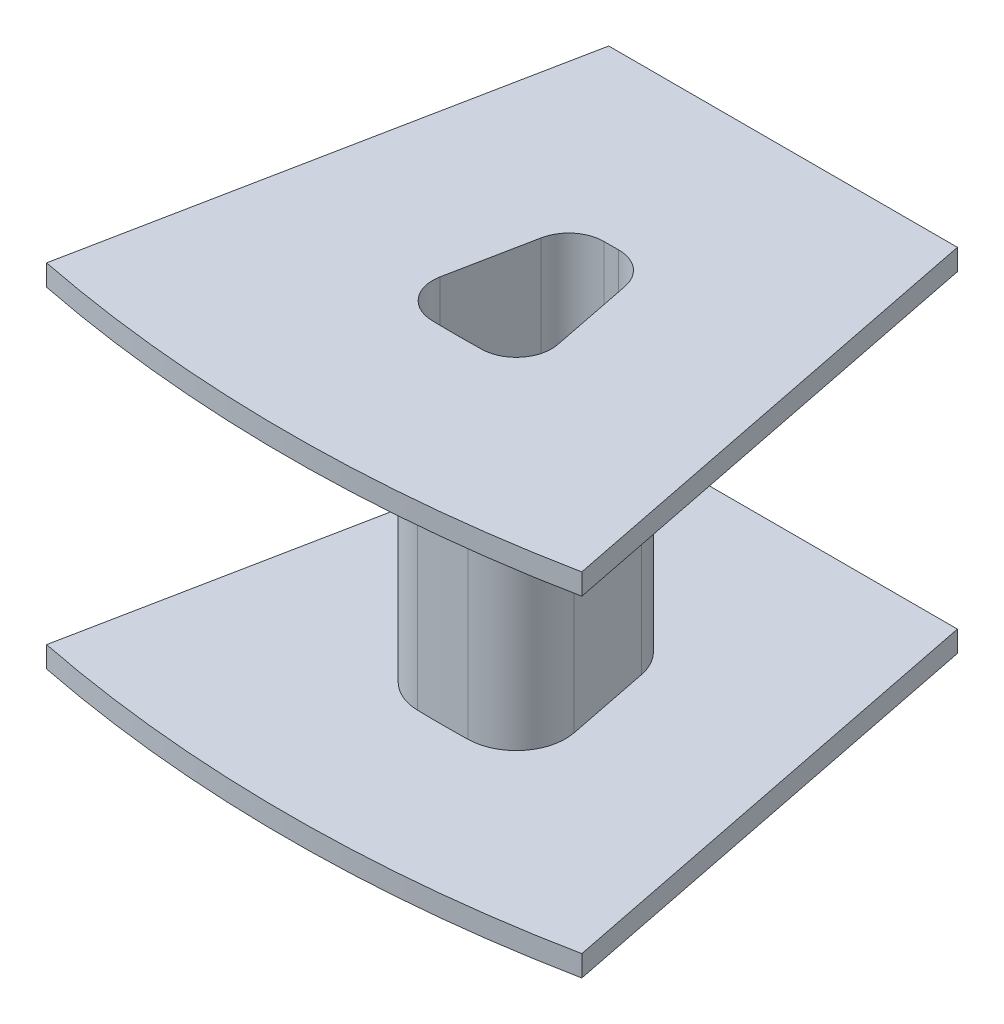
ISO-10303-21;
HEADER;
FILE_DESCRIPTION(('STEP AP214'),'2;1');
FILE_NAME('part.step','',(''),(''),'','','');
FILE_SCHEMA(('AUTOMOTIVE_DESIGN { 1 0 10303 214 1 1 1 1 }'));
ENDSEC;
DATA;
#1=APPLICATION_CONTEXT('core data for automotive mechanical design processes');
#2=APPLICATION_PROTOCOL_DEFINITION('international standard','automotive_design',2000,#1);
#3=PRODUCT_CONTEXT('',#1,'mechanical');
#4=PRODUCT('Part','Part','',(#3));
#5=PRODUCT_RELATED_PRODUCT_CATEGORY('part','',(#4));
#6=PRODUCT_DEFINITION_FORMATION('','',#4);
#7=PRODUCT_DEFINITION_CONTEXT('part definition',#1,'design');
#8=PRODUCT_DEFINITION('design','',#6,#7);
#9=PRODUCT_DEFINITION_SHAPE('','',#8);
#10=(LENGTH_UNIT() NAMED_UNIT(*) SI_UNIT(.MILLI.,.METRE.));
#11=(NAMED_UNIT(*) PLANE_ANGLE_UNIT() SI_UNIT($,.RADIAN.));
#12=(NAMED_UNIT(*) SI_UNIT($,.STERADIAN.) SOLID_ANGLE_UNIT());
#13=UNCERTAINTY_MEASURE_WITH_UNIT(LENGTH_MEASURE(1.E-05),#10,'distance_accuracy_value','');
#14=(GEOMETRIC_REPRESENTATION_CONTEXT(3) GLOBAL_UNCERTAINTY_ASSIGNED_CONTEXT((#13)) GLOBAL_UNIT_ASSIGNED_CONTEXT((#10,
#11,#12)) REPRESENTATION_CONTEXT('',''));
#15=CARTESIAN_POINT('',(0.,0.,0.));
#16=DIRECTION('',(0.,0.,1.));
#17=DIRECTION('',(1.,0.,0.));
#18=AXIS2_PLACEMENT_3D('',#15,#16,#17);
#19=CARTESIAN_POINT('',(0.,-8.5,0.));
#20=DIRECTION('',(0.,1.,0.));
#21=DIRECTION('',(0.,0.,1.));
#22=AXIS2_PLACEMENT_3D('',#19,#20,#21);
#23=PLANE('',#22);
#24=DIRECTION('',(0.195090322016122,0.,-0.980785280403232));
#25=VECTOR('',#24,1.);
#26=CARTESIAN_POINT('',(-19.0213063965724,-8.5,95.626564839315));
#27=LINE('',#26,#25);
#28=CARTESIAN_POINT('',(-19.0213063965724,-8.5,95.626564839315));
#29=VERTEX_POINT('',#28);
#30=CARTESIAN_POINT('',(-12.3920574933878,-8.5,62.2990800252019));
#31=VERTEX_POINT('',#30);
#32=EDGE_CURVE('E377',#29,#31,#27,.T.);
#33=ORIENTED_EDGE('',*,*,#32,.T.);
#34=DIRECTION('',(1.,0.,0.));
#35=VECTOR('',#34,1.);
#36=CARTESIAN_POINT('',(0.,-8.5,62.2990800252019));
#37=LINE('',#36,#35);
#38=CARTESIAN_POINT('',(12.3920574933878,-8.5,62.2990800252019));
#39=VERTEX_POINT('',#38);
#40=EDGE_CURVE('E276',#31,#39,#37,.T.);
#41=ORIENTED_EDGE('',*,*,#40,.T.);
#42=DIRECTION('',(0.195090322016122,0.,0.980785280403232));
#43=VECTOR('',#42,1.);
#44=CARTESIAN_POINT('',(19.0213063965724,-8.5,95.626564839315));
#45=LINE('',#44,#43);
#46=CARTESIAN_POINT('',(19.0213063965724,-8.5,95.626564839315));
#47=VERTEX_POINT('',#46);
#48=EDGE_CURVE('E381',#39,#47,#45,.T.);
#49=ORIENTED_EDGE('',*,*,#48,.T.);
#50=CARTESIAN_POINT('',(0.,-8.5,0.));
#51=DIRECTION('',(0.,-1.,0.));
#52=DIRECTION('',(0.,0.,1.));
#53=AXIS2_PLACEMENT_3D('',#50,#51,#52);
#54=CIRCLE('',#53,97.5);
#55=EDGE_CURVE('E374',#47,#29,#54,.T.);
#56=ORIENTED_EDGE('',*,*,#55,.T.);
#57=EDGE_LOOP('',(#33,#41,#49,#56));
#58=FACE_BOUND('',#57,.T.);
#59=CARTESIAN_POINT('',(0.,-8.5,0.));
#60=DIRECTION('',(0.,-1.,0.));
#61=DIRECTION('',(0.,0.,-1.));
#62=AXIS2_PLACEMENT_3D('',#59,#60,#61);
#63=CIRCLE('',#62,86.5);
#64=CARTESIAN_POINT('',(1.7947194017297,-8.5,86.4813793961975));
#65=VERTEX_POINT('',#64);
#66=CARTESIAN_POINT('',(-1.79471940172972,-8.5,86.4813793961975));
#67=VERTEX_POINT('',#66);
#68=EDGE_CURVE('E301',#65,#67,#63,.T.);
#69=ORIENTED_EDGE('',*,*,#68,.F.);
#70=CARTESIAN_POINT('',(1.72210069761349,-8.5,82.9821328310335));
#71=DIRECTION('',(0.,-1.,0.));
#72=DIRECTION('',(0.,0.,-1.));
#73=AXIS2_PLACEMENT_3D('',#70,#71,#72);
#74=CIRCLE('',#73,3.5);
#75=CARTESIAN_POINT('',(5.1548491790248,-8.5,82.299316703977));
#76=VERTEX_POINT('',#75);
#77=EDGE_CURVE('E306',#76,#65,#74,.T.);
#78=ORIENTED_EDGE('',*,*,#77,.F.);
#79=DIRECTION('',(0.195090322016121,0.,0.980785280403232));
#80=VECTOR('',#79,1.);
#81=CARTESIAN_POINT('',(3.96456366045838,-8.5,76.3153473095823));
#82=LINE('',#81,#80);
#83=CARTESIAN_POINT('',(3.96456366045838,-8.5,76.3153473095823));
#84=VERTEX_POINT('',#83);
#85=EDGE_CURVE('E345',#84,#76,#82,.T.);
#86=ORIENTED_EDGE('',*,*,#85,.F.);
#87=CARTESIAN_POINT('',(0.531815179047067,-8.5,76.9981634366388));
#88=DIRECTION('',(0.,-1.,0.));
#89=DIRECTION('',(0.,0.,-1.));
#90=AXIS2_PLACEMENT_3D('',#87,#88,#89);
#91=CIRCLE('',#90,3.50000000000001);
#92=CARTESIAN_POINT('',(0.507641761817665,-8.5,73.4982469167915));
#93=VERTEX_POINT('',#92);
#94=EDGE_CURVE('E342',#93,#84,#91,.T.);
#95=ORIENTED_EDGE('',*,*,#94,.F.);
#96=CARTESIAN_POINT('',(0.,-8.5,0.));
#97=DIRECTION('',(0.,1.,0.));
#98=DIRECTION('',(0.,0.,-1.));
#99=AXIS2_PLACEMENT_3D('',#96,#97,#98);
#100=CIRCLE('',#99,73.5);
#101=CARTESIAN_POINT('',(-0.507641761817631,-8.5,73.4982469167915));
#102=VERTEX_POINT('',#101);
#103=EDGE_CURVE('E339',#102,#93,#100,.T.);
#104=ORIENTED_EDGE('',*,*,#103,.F.);
#105=CARTESIAN_POINT('',(-0.531815179047067,-8.5,76.9981634366388));
#106=DIRECTION('',(0.,-1.,0.));
#107=DIRECTION('',(0.,0.,-1.));
#108=AXIS2_PLACEMENT_3D('',#105,#106,#107);
#109=CIRCLE('',#108,3.50000000000001);
#110=CARTESIAN_POINT('',(-3.96456366045838,-8.5,76.3153473095823));
#111=VERTEX_POINT('',#110);
#112=EDGE_CURVE('E336',#111,#102,#109,.T.);
#113=ORIENTED_EDGE('',*,*,#112,.F.);
#114=DIRECTION('',(0.195090322016122,0.,-0.980785280403232));
#115=VECTOR('',#114,1.);
#116=CARTESIAN_POINT('',(-5.1548491790248,-8.5,82.299316703977));
#117=LINE('',#116,#115);
#118=CARTESIAN_POINT('',(-5.1548491790248,-8.5,82.299316703977));
#119=VERTEX_POINT('',#118);
#120=EDGE_CURVE('E333',#119,#111,#117,.T.);
#121=ORIENTED_EDGE('',*,*,#120,.F.);
#122=CARTESIAN_POINT('',(-1.72210069761349,-8.5,82.9821328310335));
#123=DIRECTION('',(0.,-1.,0.));
#124=DIRECTION('',(0.,0.,-1.));
#125=AXIS2_PLACEMENT_3D('',#122,#123,#124);
#126=CIRCLE('',#125,3.5);
#127=EDGE_CURVE('E330',#67,#119,#126,.T.);
#128=ORIENTED_EDGE('',*,*,#127,.F.);
#129=EDGE_LOOP('',(#69,#78,#86,#95,#104,#113,#121,#128));
#130=FACE_BOUND('',#129,.T.);
#131=ADVANCED_FACE('F32',(#58,#130),#23,.F.);
#132=CARTESIAN_POINT('',(0.,-7.,0.));
#133=DIRECTION('',(0.,1.,0.));
#134=DIRECTION('',(0.,0.,1.));
#135=AXIS2_PLACEMENT_3D('',#132,#133,#134);
#136=PLANE('',#135);
#137=CARTESIAN_POINT('',(-0.531815179047067,-7.,76.9981634366388));
#138=DIRECTION('',(0.,1.,0.));
#139=DIRECTION('',(0.,0.,1.));
#140=AXIS2_PLACEMENT_3D('',#137,#138,#139);
#141=CIRCLE('',#140,2.50000000000001);
#142=CARTESIAN_POINT('',(-0.514548452454617,-7.,74.4982230653193));
#143=VERTEX_POINT('',#142);
#144=CARTESIAN_POINT('',(-2.98377838005515,-7.,76.5104376315985));
#145=VERTEX_POINT('',#144);
#146=EDGE_CURVE('E199',#143,#145,#141,.T.);
#147=ORIENTED_EDGE('',*,*,#146,.F.);
#148=CARTESIAN_POINT('',(0.,-7.,0.));
#149=DIRECTION('',(0.,1.,0.));
#150=DIRECTION('',(0.,0.,1.));
#151=AXIS2_PLACEMENT_3D('',#148,#149,#150);
#152=CIRCLE('',#151,74.5);
#153=CARTESIAN_POINT('',(0.51454845245463,-7.,74.4982230653193));
#154=VERTEX_POINT('',#153);
#155=EDGE_CURVE('E258',#154,#143,#152,.F.);
#156=ORIENTED_EDGE('',*,*,#155,.F.);
#157=CARTESIAN_POINT('',(0.531815179047067,-7.,76.9981634366388));
#158=DIRECTION('',(0.,1.,0.));
#159=DIRECTION('',(0.,0.,1.));
#160=AXIS2_PLACEMENT_3D('',#157,#158,#159);
#161=CIRCLE('',#160,2.5);
#162=CARTESIAN_POINT('',(2.98377838005514,-7.,76.5104376315985));
#163=VERTEX_POINT('',#162);
#164=EDGE_CURVE('E256',#163,#154,#161,.T.);
#165=ORIENTED_EDGE('',*,*,#164,.F.);
#166=DIRECTION('',(-0.195090322016122,0.,-0.980785280403232));
#167=VECTOR('',#166,1.);
#168=CARTESIAN_POINT('',(-11.7694233648383,-7.,2.34108386419336));
#169=LINE('',#168,#167);
#170=CARTESIAN_POINT('',(4.17406389862157,-7.,82.4944070259932));
#171=VERTEX_POINT('',#170);
#172=EDGE_CURVE('E254',#171,#163,#169,.T.);
#173=ORIENTED_EDGE('',*,*,#172,.F.);
#174=CARTESIAN_POINT('',(1.72210069761349,-7.,82.9821328310335));
#175=DIRECTION('',(0.,1.,0.));
#176=DIRECTION('',(0.,0.,1.));
#177=AXIS2_PLACEMENT_3D('',#174,#175,#176);
#178=CIRCLE('',#177,2.5);
#179=CARTESIAN_POINT('',(1.77397120055364,-7.,85.4815946632935));
#180=VERTEX_POINT('',#179);
#181=EDGE_CURVE('E252',#180,#171,#178,.T.);
#182=ORIENTED_EDGE('',*,*,#181,.F.);
#183=CARTESIAN_POINT('',(0.,-7.,0.));
#184=DIRECTION('',(0.,1.,0.));
#185=DIRECTION('',(0.,0.,1.));
#186=AXIS2_PLACEMENT_3D('',#183,#184,#185);
#187=CIRCLE('',#186,85.5);
#188=CARTESIAN_POINT('',(-1.77397120055366,-7.,85.4815946632935));
#189=VERTEX_POINT('',#188);
#190=EDGE_CURVE('E250',#189,#180,#187,.T.);
#191=ORIENTED_EDGE('',*,*,#190,.F.);
#192=CARTESIAN_POINT('',(-1.72210069761349,-7.,82.9821328310335));
#193=DIRECTION('',(0.,1.,0.));
#194=DIRECTION('',(0.,0.,1.));
#195=AXIS2_PLACEMENT_3D('',#192,#193,#194);
#196=CIRCLE('',#195,2.5);
#197=CARTESIAN_POINT('',(-4.17406389862157,-7.,82.4944070259932));
#198=VERTEX_POINT('',#197);
#199=EDGE_CURVE('E248',#198,#189,#196,.T.);
#200=ORIENTED_EDGE('',*,*,#199,.F.);
#201=DIRECTION('',(-0.195090322016121,0.,0.980785280403232));
#202=VECTOR('',#201,1.);
#203=CARTESIAN_POINT('',(11.7694233648382,-7.,2.34108386419333));
#204=LINE('',#203,#202);
#205=EDGE_CURVE('E230',#145,#198,#204,.T.);
#206=ORIENTED_EDGE('',*,*,#205,.F.);
#207=EDGE_LOOP('',(#147,#156,#165,#173,#182,#191,#200,#206));
#208=FACE_BOUND('',#207,.T.);
#209=DIRECTION('',(1.,0.,0.));
#210=VECTOR('',#209,1.);
#211=CARTESIAN_POINT('',(0.,-7.,62.2990800252019));
#212=LINE('',#211,#210);
#213=CARTESIAN_POINT('',(-12.3920574933878,-7.,62.2990800252019));
#214=VERTEX_POINT('',#213);
#215=CARTESIAN_POINT('',(12.3920574933878,-7.,62.2990800252019));
#216=VERTEX_POINT('',#215);
#217=EDGE_CURVE('E274',#214,#216,#212,.T.);
#218=ORIENTED_EDGE('',*,*,#217,.F.);
#219=DIRECTION('',(0.195090322016122,0.,-0.980785280403232));
#220=VECTOR('',#219,1.);
#221=CARTESIAN_POINT('',(-19.0213063965724,-7.,95.626564839315));
#222=LINE('',#221,#220);
#223=CARTESIAN_POINT('',(-19.0213063965724,-7.,95.626564839315));
#224=VERTEX_POINT('',#223);
#225=EDGE_CURVE('E385',#224,#214,#222,.T.);
#226=ORIENTED_EDGE('',*,*,#225,.F.);
#227=CARTESIAN_POINT('',(0.,-7.,0.));
#228=DIRECTION('',(0.,-1.,0.));
#229=DIRECTION('',(0.,0.,1.));
#230=AXIS2_PLACEMENT_3D('',#227,#228,#229);
#231=CIRCLE('',#230,97.5);
#232=CARTESIAN_POINT('',(19.0213063965724,-7.,95.626564839315));
#233=VERTEX_POINT('',#232);
#234=EDGE_CURVE('E373',#233,#224,#231,.T.);
#235=ORIENTED_EDGE('',*,*,#234,.F.);
#236=DIRECTION('',(0.195090322016122,0.,0.980785280403232));
#237=VECTOR('',#236,1.);
#238=CARTESIAN_POINT('',(19.0213063965724,-7.,95.626564839315));
#239=LINE('',#238,#237);
#240=EDGE_CURVE('E378',#216,#233,#239,.T.);
#241=ORIENTED_EDGE('',*,*,#240,.F.);
#242=EDGE_LOOP('',(#218,#226,#235,#241));
#243=FACE_BOUND('',#242,.T.);
#244=ADVANCED_FACE('F399',(#208,#243),#136,.T.);
#245=CARTESIAN_POINT('',(0.,-8.5,0.));
#246=DIRECTION('',(0.,1.,0.));
#247=DIRECTION('',(0.,0.,1.));
#248=AXIS2_PLACEMENT_3D('',#245,#246,#247);
#249=CYLINDRICAL_SURFACE('',#248,97.5);
#250=ORIENTED_EDGE('',*,*,#234,.T.);
#251=DIRECTION('',(0.,1.,0.));
#252=VECTOR('',#251,1.);
#253=CARTESIAN_POINT('',(-19.0213063965724,-8.5,95.626564839315));
#254=LINE('',#253,#252);
#255=EDGE_CURVE('E11',#29,#224,#254,.T.);
#256=ORIENTED_EDGE('',*,*,#255,.F.);
#257=ORIENTED_EDGE('',*,*,#55,.F.);
#258=DIRECTION('',(0.,1.,0.));
#259=VECTOR('',#258,1.);
#260=CARTESIAN_POINT('',(19.0213063965724,-8.5,95.626564839315));
#261=LINE('',#260,#259);
#262=EDGE_CURVE('E40',#47,#233,#261,.T.);
#263=ORIENTED_EDGE('',*,*,#262,.T.);
#264=EDGE_LOOP('',(#250,#256,#257,#263));
#265=FACE_BOUND('',#264,.T.);
#266=ADVANCED_FACE('F34',(#265),#249,.T.);
#267=CARTESIAN_POINT('',(-19.0213063965724,-8.5,95.626564839315));
#268=DIRECTION('',(0.980785280403232,0.,0.195090322016122));
#269=DIRECTION('',(0.195090322016122,0.,-0.980785280403232));
#270=AXIS2_PLACEMENT_3D('',#267,#268,#269);
#271=PLANE('',#270);
#272=ORIENTED_EDGE('',*,*,#225,.T.);
#273=DIRECTION('',(0.,1.,0.));
#274=VECTOR('',#273,1.);
#275=CARTESIAN_POINT('',(-12.3920574933878,-32.,62.2990800252019));
#276=LINE('',#275,#274);
#277=EDGE_CURVE('E264',#31,#214,#276,.T.);
#278=ORIENTED_EDGE('',*,*,#277,.F.);
#279=ORIENTED_EDGE('',*,*,#32,.F.);
#280=ORIENTED_EDGE('',*,*,#255,.T.);
#281=EDGE_LOOP('',(#272,#278,#279,#280));
#282=FACE_BOUND('',#281,.T.);
#283=ADVANCED_FACE('F402',(#282),#271,.F.);
#284=CARTESIAN_POINT('',(19.0213063965724,-8.5,95.626564839315));
#285=DIRECTION('',(-0.980785280403232,0.,0.195090322016122));
#286=DIRECTION('',(0.195090322016122,0.,0.980785280403232));
#287=AXIS2_PLACEMENT_3D('',#284,#285,#286);
#288=PLANE('',#287);
#289=ORIENTED_EDGE('',*,*,#48,.F.);
#290=DIRECTION('',(0.,1.,0.));
#291=VECTOR('',#290,1.);
#292=CARTESIAN_POINT('',(12.3920574933878,-32.,62.2990800252019));
#293=LINE('',#292,#291);
#294=EDGE_CURVE('E269',#39,#216,#293,.T.);
#295=ORIENTED_EDGE('',*,*,#294,.T.);
#296=ORIENTED_EDGE('',*,*,#240,.T.);
#297=ORIENTED_EDGE('',*,*,#262,.F.);
#298=EDGE_LOOP('',(#289,#295,#296,#297));
#299=FACE_BOUND('',#298,.T.);
#300=ADVANCED_FACE('F406',(#299),#288,.F.);
#301=CARTESIAN_POINT('',(0.,-30.5,0.));
#302=DIRECTION('',(0.,1.,0.));
#303=DIRECTION('',(0.,0.,1.));
#304=AXIS2_PLACEMENT_3D('',#301,#302,#303);
#305=CYLINDRICAL_SURFACE('',#304,86.5);
#306=ORIENTED_EDGE('',*,*,#68,.T.);
#307=DIRECTION('',(0.,1.,0.));
#308=VECTOR('',#307,1.);
#309=CARTESIAN_POINT('',(-1.79471940172972,-30.5,86.4813793961975));
#310=LINE('',#309,#308);
#311=CARTESIAN_POINT('',(-1.79471940172972,-30.5,86.4813793961975));
#312=VERTEX_POINT('',#311);
#313=EDGE_CURVE('E370',#312,#67,#310,.T.);
#314=ORIENTED_EDGE('',*,*,#313,.F.);
#315=CARTESIAN_POINT('',(0.,-30.5,0.));
#316=DIRECTION('',(0.,-1.,0.));
#317=DIRECTION('',(0.,0.,-1.));
#318=AXIS2_PLACEMENT_3D('',#315,#316,#317);
#319=CIRCLE('',#318,86.5);
#320=CARTESIAN_POINT('',(1.7947194017297,-30.5,86.4813793961975));
#321=VERTEX_POINT('',#320);
#322=EDGE_CURVE('E302',#321,#312,#319,.T.);
#323=ORIENTED_EDGE('',*,*,#322,.F.);
#324=DIRECTION('',(0.,1.,0.));
#325=VECTOR('',#324,1.);
#326=CARTESIAN_POINT('',(1.7947194017297,-30.5,86.4813793961975));
#327=LINE('',#326,#325);
#328=EDGE_CURVE('E327',#321,#65,#327,.T.);
#329=ORIENTED_EDGE('',*,*,#328,.T.);
#330=EDGE_LOOP('',(#306,#314,#323,#329));
#331=FACE_BOUND('',#330,.T.);
#332=ADVANCED_FACE('F429',(#331),#305,.T.);
#333=CARTESIAN_POINT('',(-1.72210069761349,-30.5,82.9821328310335));
#334=DIRECTION('',(0.,1.,0.));
#335=DIRECTION('',(0.,0.,1.));
#336=AXIS2_PLACEMENT_3D('',#333,#334,#335);
#337=CYLINDRICAL_SURFACE('',#336,3.5);
#338=ORIENTED_EDGE('',*,*,#127,.T.);
#339=DIRECTION('',(0.,1.,0.));
#340=VECTOR('',#339,1.);
#341=CARTESIAN_POINT('',(-5.15484917902481,-30.5,82.299316703977));
#342=LINE('',#341,#340);
#343=CARTESIAN_POINT('',(-5.15484917902481,-30.5,82.299316703977));
#344=VERTEX_POINT('',#343);
#345=EDGE_CURVE('E367',#344,#119,#342,.T.);
#346=ORIENTED_EDGE('',*,*,#345,.F.);
#347=CARTESIAN_POINT('',(-1.72210069761349,-30.5,82.9821328310335));
#348=DIRECTION('',(0.,-1.,0.));
#349=DIRECTION('',(0.,0.,-1.));
#350=AXIS2_PLACEMENT_3D('',#347,#348,#349);
#351=CIRCLE('',#350,3.5);
#352=EDGE_CURVE('E305',#312,#344,#351,.T.);
#353=ORIENTED_EDGE('',*,*,#352,.F.);
#354=ORIENTED_EDGE('',*,*,#313,.T.);
#355=EDGE_LOOP('',(#338,#346,#353,#354));
#356=FACE_BOUND('',#355,.T.);
#357=ADVANCED_FACE('F606',(#356),#337,.T.);
#358=CARTESIAN_POINT('',(-5.1548491790248,-30.5,82.299316703977));
#359=DIRECTION('',(0.980785280403232,0.,0.195090322016122));
#360=DIRECTION('',(0.195090322016122,0.,-0.980785280403232));
#361=AXIS2_PLACEMENT_3D('',#358,#359,#360);
#362=PLANE('',#361);
#363=ORIENTED_EDGE('',*,*,#120,.T.);
#364=DIRECTION('',(0.,1.,0.));
#365=VECTOR('',#364,1.);
#366=CARTESIAN_POINT('',(-3.96456366045838,-30.5,76.3153473095823));
#367=LINE('',#366,#365);
#368=CARTESIAN_POINT('',(-3.96456366045838,-30.5,76.3153473095823));
#369=VERTEX_POINT('',#368);
#370=EDGE_CURVE('E364',#369,#111,#367,.T.);
#371=ORIENTED_EDGE('',*,*,#370,.F.);
#372=DIRECTION('',(0.195090322016122,0.,-0.980785280403232));
#373=VECTOR('',#372,1.);
#374=CARTESIAN_POINT('',(-5.1548491790248,-30.5,82.299316703977));
#375=LINE('',#374,#373);
#376=EDGE_CURVE('E309',#344,#369,#375,.T.);
#377=ORIENTED_EDGE('',*,*,#376,.F.);
#378=ORIENTED_EDGE('',*,*,#345,.T.);
#379=EDGE_LOOP('',(#363,#371,#377,#378));
#380=FACE_BOUND('',#379,.T.);
#381=ADVANCED_FACE('F603',(#380),#362,.F.);
#382=CARTESIAN_POINT('',(-0.531815179047067,-30.5,76.9981634366388));
#383=DIRECTION('',(0.,1.,0.));
#384=DIRECTION('',(0.,0.,1.));
#385=AXIS2_PLACEMENT_3D('',#382,#383,#384);
#386=CYLINDRICAL_SURFACE('',#385,3.50000000000001);
#387=ORIENTED_EDGE('',*,*,#112,.T.);
#388=DIRECTION('',(0.,1.,0.));
#389=VECTOR('',#388,1.);
#390=CARTESIAN_POINT('',(-0.507641761817631,-30.5,73.4982469167915));
#391=LINE('',#390,#389);
#392=CARTESIAN_POINT('',(-0.507641761817631,-30.5,73.4982469167915));
#393=VERTEX_POINT('',#392);
#394=EDGE_CURVE('E361',#393,#102,#391,.T.);
#395=ORIENTED_EDGE('',*,*,#394,.F.);
#396=CARTESIAN_POINT('',(-0.531815179047067,-30.5,76.9981634366388));
#397=DIRECTION('',(0.,-1.,0.));
#398=DIRECTION('',(0.,0.,-1.));
#399=AXIS2_PLACEMENT_3D('',#396,#397,#398);
#400=CIRCLE('',#399,3.50000000000001);
#401=EDGE_CURVE('E312',#369,#393,#400,.T.);
#402=ORIENTED_EDGE('',*,*,#401,.F.);
#403=ORIENTED_EDGE('',*,*,#370,.T.);
#404=EDGE_LOOP('',(#387,#395,#402,#403));
#405=FACE_BOUND('',#404,.T.);
#406=ADVANCED_FACE('F599',(#405),#386,.T.);
#407=CARTESIAN_POINT('',(0.,-30.5,0.));
#408=DIRECTION('',(0.,1.,0.));
#409=DIRECTION('',(0.,0.,1.));
#410=AXIS2_PLACEMENT_3D('',#407,#408,#409);
#411=CYLINDRICAL_SURFACE('',#410,73.5);
#412=ORIENTED_EDGE('',*,*,#103,.T.);
#413=DIRECTION('',(0.,1.,0.));
#414=VECTOR('',#413,1.);
#415=CARTESIAN_POINT('',(0.507641761817665,-30.5,73.4982469167915));
#416=LINE('',#415,#414);
#417=CARTESIAN_POINT('',(0.507641761817665,-30.5,73.4982469167915));
#418=VERTEX_POINT('',#417);
#419=EDGE_CURVE('E358',#418,#93,#416,.T.);
#420=ORIENTED_EDGE('',*,*,#419,.F.);
#421=CARTESIAN_POINT('',(0.,-30.5,0.));
#422=DIRECTION('',(0.,1.,0.));
#423=DIRECTION('',(0.,0.,-1.));
#424=AXIS2_PLACEMENT_3D('',#421,#422,#423);
#425=CIRCLE('',#424,73.5);
#426=EDGE_CURVE('E315',#393,#418,#425,.T.);
#427=ORIENTED_EDGE('',*,*,#426,.F.);
#428=ORIENTED_EDGE('',*,*,#394,.T.);
#429=EDGE_LOOP('',(#412,#420,#427,#428));
#430=FACE_BOUND('',#429,.T.);
#431=ADVANCED_FACE('F595',(#430),#411,.F.);
#432=CARTESIAN_POINT('',(0.531815179047067,-30.5,76.9981634366388));
#433=DIRECTION('',(0.,1.,0.));
#434=DIRECTION('',(0.,0.,1.));
#435=AXIS2_PLACEMENT_3D('',#432,#433,#434);
#436=CYLINDRICAL_SURFACE('',#435,3.50000000000001);
#437=ORIENTED_EDGE('',*,*,#94,.T.);
#438=DIRECTION('',(0.,1.,0.));
#439=VECTOR('',#438,1.);
#440=CARTESIAN_POINT('',(3.96456366045838,-30.5,76.3153473095823));
#441=LINE('',#440,#439);
#442=CARTESIAN_POINT('',(3.96456366045838,-30.5,76.3153473095823));
#443=VERTEX_POINT('',#442);
#444=EDGE_CURVE('E355',#443,#84,#441,.T.);
#445=ORIENTED_EDGE('',*,*,#444,.F.);
#446=CARTESIAN_POINT('',(0.531815179047067,-30.5,76.9981634366388));
#447=DIRECTION('',(0.,-1.,0.));
#448=DIRECTION('',(0.,0.,-1.));
#449=AXIS2_PLACEMENT_3D('',#446,#447,#448);
#450=CIRCLE('',#449,3.50000000000001);
#451=EDGE_CURVE('E318',#418,#443,#450,.T.);
#452=ORIENTED_EDGE('',*,*,#451,.F.);
#453=ORIENTED_EDGE('',*,*,#419,.T.);
#454=EDGE_LOOP('',(#437,#445,#452,#453));
#455=FACE_BOUND('',#454,.T.);
#456=ADVANCED_FACE('F591',(#455),#436,.T.);
#457=CARTESIAN_POINT('',(3.96456366045838,-30.5,76.3153473095823));
#458=DIRECTION('',(-0.980785280403232,0.,0.195090322016121));
#459=DIRECTION('',(0.195090322016121,0.,0.980785280403232));
#460=AXIS2_PLACEMENT_3D('',#457,#458,#459);
#461=PLANE('',#460);
#462=ORIENTED_EDGE('',*,*,#85,.T.);
#463=DIRECTION('',(0.,1.,0.));
#464=VECTOR('',#463,1.);
#465=CARTESIAN_POINT('',(5.1548491790248,-30.5,82.299316703977));
#466=LINE('',#465,#464);
#467=CARTESIAN_POINT('',(5.1548491790248,-30.5,82.299316703977));
#468=VERTEX_POINT('',#467);
#469=EDGE_CURVE('E352',#468,#76,#466,.T.);
#470=ORIENTED_EDGE('',*,*,#469,.F.);
#471=DIRECTION('',(0.195090322016121,0.,0.980785280403232));
#472=VECTOR('',#471,1.);
#473=CARTESIAN_POINT('',(3.96456366045838,-30.5,76.3153473095823));
#474=LINE('',#473,#472);
#475=EDGE_CURVE('E321',#443,#468,#474,.T.);
#476=ORIENTED_EDGE('',*,*,#475,.F.);
#477=ORIENTED_EDGE('',*,*,#444,.T.);
#478=EDGE_LOOP('',(#462,#470,#476,#477));
#479=FACE_BOUND('',#478,.T.);
#480=ADVANCED_FACE('F587',(#479),#461,.F.);
#481=CARTESIAN_POINT('',(1.72210069761349,-30.5,82.9821328310335));
#482=DIRECTION('',(0.,1.,0.));
#483=DIRECTION('',(0.,0.,1.));
#484=AXIS2_PLACEMENT_3D('',#481,#482,#483);
#485=CYLINDRICAL_SURFACE('',#484,3.5);
#486=ORIENTED_EDGE('',*,*,#77,.T.);
#487=ORIENTED_EDGE('',*,*,#328,.F.);
#488=CARTESIAN_POINT('',(1.72210069761349,-30.5,82.9821328310335));
#489=DIRECTION('',(0.,-1.,0.));
#490=DIRECTION('',(0.,0.,-1.));
#491=AXIS2_PLACEMENT_3D('',#488,#489,#490);
#492=CIRCLE('',#491,3.5);
#493=EDGE_CURVE('E324',#468,#321,#492,.T.);
#494=ORIENTED_EDGE('',*,*,#493,.F.);
#495=ORIENTED_EDGE('',*,*,#469,.T.);
#496=EDGE_LOOP('',(#486,#487,#494,#495));
#497=FACE_BOUND('',#496,.T.);
#498=ADVANCED_FACE('F542',(#497),#485,.T.);
#499=CARTESIAN_POINT('',(0.,-32.,0.));
#500=DIRECTION('',(0.,-1.,0.));
#501=DIRECTION('',(0.,0.,-1.));
#502=AXIS2_PLACEMENT_3D('',#499,#500,#501);
#503=PLANE('',#502);
#504=CARTESIAN_POINT('',(-0.531815179047067,-32.,76.9981634366388));
#505=DIRECTION('',(0.,1.,0.));
#506=DIRECTION('',(0.,0.,1.));
#507=AXIS2_PLACEMENT_3D('',#504,#505,#506);
#508=CIRCLE('',#507,2.50000000000001);
#509=CARTESIAN_POINT('',(-0.514548452454617,-32.,74.4982230653193));
#510=VERTEX_POINT('',#509);
#511=CARTESIAN_POINT('',(-2.98377838005515,-32.,76.5104376315985));
#512=VERTEX_POINT('',#511);
#513=EDGE_CURVE('E196',#510,#512,#508,.T.);
#514=ORIENTED_EDGE('',*,*,#513,.T.);
#515=DIRECTION('',(-0.195090322016121,0.,0.980785280403232));
#516=VECTOR('',#515,1.);
#517=CARTESIAN_POINT('',(-2.98377838005515,-32.,76.5104376315985));
#518=LINE('',#517,#516);
#519=CARTESIAN_POINT('',(-4.17406389862157,-32.,82.4944070259932));
#520=VERTEX_POINT('',#519);
#521=EDGE_CURVE('E205',#512,#520,#518,.T.);
#522=ORIENTED_EDGE('',*,*,#521,.T.);
#523=CARTESIAN_POINT('',(-1.72210069761349,-32.,82.9821328310335));
#524=DIRECTION('',(0.,1.,0.));
#525=DIRECTION('',(0.,0.,1.));
#526=AXIS2_PLACEMENT_3D('',#523,#524,#525);
#527=CIRCLE('',#526,2.5);
#528=CARTESIAN_POINT('',(-1.77397120055366,-32.,85.4815946632935));
#529=VERTEX_POINT('',#528);
#530=EDGE_CURVE('E55',#520,#529,#527,.T.);
#531=ORIENTED_EDGE('',*,*,#530,.T.);
#532=CARTESIAN_POINT('',(0.,-32.,0.));
#533=DIRECTION('',(0.,1.,0.));
#534=DIRECTION('',(0.,0.,1.));
#535=AXIS2_PLACEMENT_3D('',#532,#533,#534);
#536=CIRCLE('',#535,85.5);
#537=CARTESIAN_POINT('',(1.77397120055364,-32.,85.4815946632935));
#538=VERTEX_POINT('',#537);
#539=EDGE_CURVE('E216',#529,#538,#536,.T.);
#540=ORIENTED_EDGE('',*,*,#539,.T.);
#541=CARTESIAN_POINT('',(1.72210069761349,-32.,82.9821328310335));
#542=DIRECTION('',(0.,1.,0.));
#543=DIRECTION('',(0.,0.,1.));
#544=AXIS2_PLACEMENT_3D('',#541,#542,#543);
#545=CIRCLE('',#544,2.5);
#546=CARTESIAN_POINT('',(4.17406389862157,-32.,82.4944070259932));
#547=VERTEX_POINT('',#546);
#548=EDGE_CURVE('E219',#538,#547,#545,.T.);
#549=ORIENTED_EDGE('',*,*,#548,.T.);
#550=DIRECTION('',(-0.195090322016122,0.,-0.980785280403232));
#551=VECTOR('',#550,1.);
#552=CARTESIAN_POINT('',(4.17406389862157,-32.,82.4944070259932));
#553=LINE('',#552,#551);
#554=CARTESIAN_POINT('',(2.98377838005514,-32.,76.5104376315985));
#555=VERTEX_POINT('',#554);
#556=EDGE_CURVE('E222',#547,#555,#553,.T.);
#557=ORIENTED_EDGE('',*,*,#556,.T.);
#558=CARTESIAN_POINT('',(0.531815179047067,-32.,76.9981634366388));
#559=DIRECTION('',(0.,1.,0.));
#560=DIRECTION('',(0.,0.,1.));
#561=AXIS2_PLACEMENT_3D('',#558,#559,#560);
#562=CIRCLE('',#561,2.5);
#563=CARTESIAN_POINT('',(0.51454845245463,-32.,74.4982230653193));
#564=VERTEX_POINT('',#563);
#565=EDGE_CURVE('E225',#555,#564,#562,.T.);
#566=ORIENTED_EDGE('',*,*,#565,.T.);
#567=CARTESIAN_POINT('',(0.,-32.,0.));
#568=DIRECTION('',(0.,-1.,0.));
#569=DIRECTION('',(0.,0.,1.));
#570=AXIS2_PLACEMENT_3D('',#567,#568,#569);
#571=CIRCLE('',#570,74.5);
#572=EDGE_CURVE('E202',#564,#510,#571,.T.);
#573=ORIENTED_EDGE('',*,*,#572,.T.);
#574=EDGE_LOOP('',(#514,#522,#531,#540,#549,#557,#566,#573));
#575=FACE_BOUND('',#574,.T.);
#576=DIRECTION('',(1.,0.,0.));
#577=VECTOR('',#576,1.);
#578=CARTESIAN_POINT('',(-12.3920574933878,-32.,62.2990800252019));
#579=LINE('',#578,#577);
#580=CARTESIAN_POINT('',(-12.3920574933878,-32.,62.2990800252019));
#581=VERTEX_POINT('',#580);
#582=CARTESIAN_POINT('',(12.3920574933878,-32.,62.2990800252019));
#583=VERTEX_POINT('',#582);
#584=EDGE_CURVE('E261',#581,#583,#579,.T.);
#585=ORIENTED_EDGE('',*,*,#584,.T.);
#586=DIRECTION('',(0.195090322016122,0.,0.980785280403232));
#587=VECTOR('',#586,1.);
#588=CARTESIAN_POINT('',(12.1931451260081,-32.,61.2990800252019));
#589=LINE('',#588,#587);
#590=CARTESIAN_POINT('',(19.0213063965724,-32.,95.626564839315));
#591=VERTEX_POINT('',#590);
#592=EDGE_CURVE('E287',#583,#591,#589,.T.);
#593=ORIENTED_EDGE('',*,*,#592,.T.);
#594=CARTESIAN_POINT('',(0.,-32.,0.));
#595=DIRECTION('',(0.,-1.,0.));
#596=DIRECTION('',(0.,0.,-1.));
#597=AXIS2_PLACEMENT_3D('',#594,#595,#596);
#598=CIRCLE('',#597,97.5);
#599=CARTESIAN_POINT('',(-19.0213063965724,-32.,95.626564839315));
#600=VERTEX_POINT('',#599);
#601=EDGE_CURVE('E280',#591,#600,#598,.T.);
#602=ORIENTED_EDGE('',*,*,#601,.T.);
#603=DIRECTION('',(0.195090322016121,0.,-0.980785280403232));
#604=VECTOR('',#603,1.);
#605=CARTESIAN_POINT('',(-19.0213063965724,-32.,95.626564839315));
#606=LINE('',#605,#604);
#607=EDGE_CURVE('E283',#600,#581,#606,.T.);
#608=ORIENTED_EDGE('',*,*,#607,.T.);
#609=EDGE_LOOP('',(#585,#593,#602,#608));
#610=FACE_BOUND('',#609,.T.);
#611=ADVANCED_FACE('F209',(#575,#610),#503,.T.);
#612=CARTESIAN_POINT('',(0.,-30.5,0.));
#613=DIRECTION('',(0.,-1.,0.));
#614=DIRECTION('',(0.,0.,-1.));
#615=AXIS2_PLACEMENT_3D('',#612,#613,#614);
#616=PLANE('',#615);
#617=ORIENTED_EDGE('',*,*,#493,.T.);
#618=ORIENTED_EDGE('',*,*,#322,.T.);
#619=ORIENTED_EDGE('',*,*,#352,.T.);
#620=ORIENTED_EDGE('',*,*,#376,.T.);
#621=ORIENTED_EDGE('',*,*,#401,.T.);
#622=ORIENTED_EDGE('',*,*,#426,.T.);
#623=ORIENTED_EDGE('',*,*,#451,.T.);
#624=ORIENTED_EDGE('',*,*,#475,.T.);
#625=EDGE_LOOP('',(#617,#618,#619,#620,#621,#622,#623,#624));
#626=FACE_BOUND('',#625,.T.);
#627=DIRECTION('',(0.195090322016122,0.,0.980785280403232));
#628=VECTOR('',#627,1.);
#629=CARTESIAN_POINT('',(12.1931451260081,-30.5,61.2990800252019));
#630=LINE('',#629,#628);
#631=CARTESIAN_POINT('',(12.3920574933878,-30.5,62.2990800252019));
#632=VERTEX_POINT('',#631);
#633=CARTESIAN_POINT('',(19.0213063965724,-30.5,95.626564839315));
#634=VERTEX_POINT('',#633);
#635=EDGE_CURVE('E284',#632,#634,#630,.T.);
#636=ORIENTED_EDGE('',*,*,#635,.F.);
#637=DIRECTION('',(-1.,0.,0.));
#638=VECTOR('',#637,1.);
#639=CARTESIAN_POINT('',(0.,-30.5,62.2990800252019));
#640=LINE('',#639,#638);
#641=CARTESIAN_POINT('',(-12.3920574933878,-30.5,62.2990800252019));
#642=VERTEX_POINT('',#641);
#643=EDGE_CURVE('E268',#632,#642,#640,.T.);
#644=ORIENTED_EDGE('',*,*,#643,.T.);
#645=DIRECTION('',(0.195090322016121,0.,-0.980785280403232));
#646=VECTOR('',#645,1.);
#647=CARTESIAN_POINT('',(-19.0213063965724,-30.5,95.626564839315));
#648=LINE('',#647,#646);
#649=CARTESIAN_POINT('',(-19.0213063965724,-30.5,95.626564839315));
#650=VERTEX_POINT('',#649);
#651=EDGE_CURVE('E292',#650,#642,#648,.T.);
#652=ORIENTED_EDGE('',*,*,#651,.F.);
#653=CARTESIAN_POINT('',(0.,-30.5,0.));
#654=DIRECTION('',(0.,-1.,0.));
#655=DIRECTION('',(0.,0.,-1.));
#656=AXIS2_PLACEMENT_3D('',#653,#654,#655);
#657=CIRCLE('',#656,97.5);
#658=EDGE_CURVE('E279',#634,#650,#657,.T.);
#659=ORIENTED_EDGE('',*,*,#658,.F.);
#660=EDGE_LOOP('',(#636,#644,#652,#659));
#661=FACE_BOUND('',#660,.T.);
#662=ADVANCED_FACE('F541',(#626,#661),#616,.F.);
#663=CARTESIAN_POINT('',(0.,-32.,0.));
#664=DIRECTION('',(0.,1.,0.));
#665=DIRECTION('',(0.,0.,1.));
#666=AXIS2_PLACEMENT_3D('',#663,#664,#665);
#667=CYLINDRICAL_SURFACE('',#666,97.5);
#668=ORIENTED_EDGE('',*,*,#658,.T.);
#669=DIRECTION('',(0.,1.,0.));
#670=VECTOR('',#669,1.);
#671=CARTESIAN_POINT('',(-19.0213063965724,-32.,95.626564839315));
#672=LINE('',#671,#670);
#673=EDGE_CURVE('E298',#600,#650,#672,.T.);
#674=ORIENTED_EDGE('',*,*,#673,.F.);
#675=ORIENTED_EDGE('',*,*,#601,.F.);
#676=DIRECTION('',(0.,1.,0.));
#677=VECTOR('',#676,1.);
#678=CARTESIAN_POINT('',(19.0213063965724,-32.,95.626564839315));
#679=LINE('',#678,#677);
#680=EDGE_CURVE('E289',#591,#634,#679,.T.);
#681=ORIENTED_EDGE('',*,*,#680,.T.);
#682=EDGE_LOOP('',(#668,#674,#675,#681));
#683=FACE_BOUND('',#682,.T.);
#684=ADVANCED_FACE('F549',(#683),#667,.T.);
#685=CARTESIAN_POINT('',(-19.0213063965724,-32.,95.626564839315));
#686=DIRECTION('',(0.980785280403232,0.,0.195090322016121));
#687=DIRECTION('',(0.195090322016121,0.,-0.980785280403232));
#688=AXIS2_PLACEMENT_3D('',#685,#686,#687);
#689=PLANE('',#688);
#690=ORIENTED_EDGE('',*,*,#651,.T.);
#691=EDGE_CURVE('E270',#581,#642,#276,.T.);
#692=ORIENTED_EDGE('',*,*,#691,.F.);
#693=ORIENTED_EDGE('',*,*,#607,.F.);
#694=ORIENTED_EDGE('',*,*,#673,.T.);
#695=EDGE_LOOP('',(#690,#692,#693,#694));
#696=FACE_BOUND('',#695,.T.);
#697=ADVANCED_FACE('F561',(#696),#689,.F.);
#698=CARTESIAN_POINT('',(12.1931451260081,-32.,61.2990800252019));
#699=DIRECTION('',(-0.980785280403232,0.,0.195090322016122));
#700=DIRECTION('',(0.195090322016122,0.,0.980785280403232));
#701=AXIS2_PLACEMENT_3D('',#698,#699,#700);
#702=PLANE('',#701);
#703=ORIENTED_EDGE('',*,*,#592,.F.);
#704=EDGE_CURVE('E265',#583,#632,#293,.T.);
#705=ORIENTED_EDGE('',*,*,#704,.T.);
#706=ORIENTED_EDGE('',*,*,#635,.T.);
#707=ORIENTED_EDGE('',*,*,#680,.F.);
#708=EDGE_LOOP('',(#703,#705,#706,#707));
#709=FACE_BOUND('',#708,.T.);
#710=ADVANCED_FACE('F418',(#709),#702,.F.);
#711=CARTESIAN_POINT('',(-12.3920574933878,-32.,62.2990800252019));
#712=DIRECTION('',(0.,0.,1.));
#713=DIRECTION('',(1.,0.,0.));
#714=AXIS2_PLACEMENT_3D('',#711,#712,#713);
#715=PLANE('',#714);
#716=ORIENTED_EDGE('',*,*,#704,.F.);
#717=ORIENTED_EDGE('',*,*,#584,.F.);
#718=ORIENTED_EDGE('',*,*,#691,.T.);
#719=ORIENTED_EDGE('',*,*,#643,.F.);
#720=EDGE_LOOP('',(#716,#717,#718,#719));
#721=FACE_BOUND('',#720,.T.);
#722=ADVANCED_FACE('F410',(#721),#715,.F.);
#723=ORIENTED_EDGE('',*,*,#277,.T.);
#724=ORIENTED_EDGE('',*,*,#217,.T.);
#725=ORIENTED_EDGE('',*,*,#294,.F.);
#726=ORIENTED_EDGE('',*,*,#40,.F.);
#727=EDGE_LOOP('',(#723,#724,#725,#726));
#728=FACE_BOUND('',#727,.T.);
#729=ADVANCED_FACE('F408',(#728),#715,.F.);
#730=CARTESIAN_POINT('',(-0.531815179047067,-32.,76.9981634366388));
#731=DIRECTION('',(0.,1.,0.));
#732=DIRECTION('',(0.,0.,1.));
#733=AXIS2_PLACEMENT_3D('',#730,#731,#732);
#734=CYLINDRICAL_SURFACE('',#733,2.50000000000001);
#735=ORIENTED_EDGE('',*,*,#146,.T.);
#736=DIRECTION('',(0.,1.,0.));
#737=VECTOR('',#736,1.);
#738=CARTESIAN_POINT('',(-2.98377838005515,-32.,76.5104376315985));
#739=LINE('',#738,#737);
#740=EDGE_CURVE('E47',#512,#145,#739,.T.);
#741=ORIENTED_EDGE('',*,*,#740,.F.);
#742=ORIENTED_EDGE('',*,*,#513,.F.);
#743=DIRECTION('',(0.,1.,0.));
#744=VECTOR('',#743,1.);
#745=CARTESIAN_POINT('',(-0.514548452454617,-32.,74.4982230653193));
#746=LINE('',#745,#744);
#747=EDGE_CURVE('E228',#510,#143,#746,.T.);
#748=ORIENTED_EDGE('',*,*,#747,.T.);
#749=EDGE_LOOP('',(#735,#741,#742,#748));
#750=FACE_BOUND('',#749,.T.);
#751=ADVANCED_FACE('F193',(#750),#734,.F.);
#752=CARTESIAN_POINT('',(0.,-32.,0.));
#753=DIRECTION('',(0.,1.,0.));
#754=DIRECTION('',(0.,0.,1.));
#755=AXIS2_PLACEMENT_3D('',#752,#753,#754);
#756=CYLINDRICAL_SURFACE('',#755,74.5);
#757=ORIENTED_EDGE('',*,*,#155,.T.);
#758=ORIENTED_EDGE('',*,*,#747,.F.);
#759=ORIENTED_EDGE('',*,*,#572,.F.);
#760=DIRECTION('',(0.,1.,0.));
#761=VECTOR('',#760,1.);
#762=CARTESIAN_POINT('',(0.51454845245463,-32.,74.4982230653193));
#763=LINE('',#762,#761);
#764=EDGE_CURVE('E231',#564,#154,#763,.T.);
#765=ORIENTED_EDGE('',*,*,#764,.T.);
#766=EDGE_LOOP('',(#757,#758,#759,#765));
#767=FACE_BOUND('',#766,.T.);
#768=ADVANCED_FACE('F416',(#767),#756,.T.);
#769=CARTESIAN_POINT('',(0.531815179047067,-32.,76.9981634366388));
#770=DIRECTION('',(0.,1.,0.));
#771=DIRECTION('',(0.,0.,1.));
#772=AXIS2_PLACEMENT_3D('',#769,#770,#771);
#773=CYLINDRICAL_SURFACE('',#772,2.5);
#774=ORIENTED_EDGE('',*,*,#164,.T.);
#775=ORIENTED_EDGE('',*,*,#764,.F.);
#776=ORIENTED_EDGE('',*,*,#565,.F.);
#777=DIRECTION('',(0.,1.,0.));
#778=VECTOR('',#777,1.);
#779=CARTESIAN_POINT('',(2.98377838005514,-32.,76.5104376315985));
#780=LINE('',#779,#778);
#781=EDGE_CURVE('E234',#555,#163,#780,.T.);
#782=ORIENTED_EDGE('',*,*,#781,.T.);
#783=EDGE_LOOP('',(#774,#775,#776,#782));
#784=FACE_BOUND('',#783,.T.);
#785=ADVANCED_FACE('F475',(#784),#773,.F.);
#786=CARTESIAN_POINT('',(4.17406389862157,-32.,82.4944070259932));
#787=DIRECTION('',(0.980785280403232,0.,-0.195090322016122));
#788=DIRECTION('',(-0.195090322016122,0.,-0.980785280403232));
#789=AXIS2_PLACEMENT_3D('',#786,#787,#788);
#790=PLANE('',#789);
#791=ORIENTED_EDGE('',*,*,#172,.T.);
#792=ORIENTED_EDGE('',*,*,#781,.F.);
#793=ORIENTED_EDGE('',*,*,#556,.F.);
#794=DIRECTION('',(0.,1.,0.));
#795=VECTOR('',#794,1.);
#796=CARTESIAN_POINT('',(4.17406389862157,-32.,82.4944070259932));
#797=LINE('',#796,#795);
#798=EDGE_CURVE('E237',#547,#171,#797,.T.);
#799=ORIENTED_EDGE('',*,*,#798,.T.);
#800=EDGE_LOOP('',(#791,#792,#793,#799));
#801=FACE_BOUND('',#800,.T.);
#802=ADVANCED_FACE('F486',(#801),#790,.F.);
#803=CARTESIAN_POINT('',(1.72210069761349,-32.,82.9821328310335));
#804=DIRECTION('',(0.,1.,0.));
#805=DIRECTION('',(0.,0.,1.));
#806=AXIS2_PLACEMENT_3D('',#803,#804,#805);
#807=CYLINDRICAL_SURFACE('',#806,2.5);
#808=ORIENTED_EDGE('',*,*,#181,.T.);
#809=ORIENTED_EDGE('',*,*,#798,.F.);
#810=ORIENTED_EDGE('',*,*,#548,.F.);
#811=DIRECTION('',(0.,1.,0.));
#812=VECTOR('',#811,1.);
#813=CARTESIAN_POINT('',(1.77397120055364,-32.,85.4815946632935));
#814=LINE('',#813,#812);
#815=EDGE_CURVE('E240',#538,#180,#814,.T.);
#816=ORIENTED_EDGE('',*,*,#815,.T.);
#817=EDGE_LOOP('',(#808,#809,#810,#816));
#818=FACE_BOUND('',#817,.T.);
#819=ADVANCED_FACE('F496',(#818),#807,.F.);
#820=CARTESIAN_POINT('',(0.,-32.,0.));
#821=DIRECTION('',(0.,1.,0.));
#822=DIRECTION('',(0.,0.,1.));
#823=AXIS2_PLACEMENT_3D('',#820,#821,#822);
#824=CYLINDRICAL_SURFACE('',#823,85.5);
#825=ORIENTED_EDGE('',*,*,#190,.T.);
#826=ORIENTED_EDGE('',*,*,#815,.F.);
#827=ORIENTED_EDGE('',*,*,#539,.F.);
#828=DIRECTION('',(0.,1.,0.));
#829=VECTOR('',#828,1.);
#830=CARTESIAN_POINT('',(-1.77397120055366,-32.,85.4815946632935));
#831=LINE('',#830,#829);
#832=EDGE_CURVE('E243',#529,#189,#831,.T.);
#833=ORIENTED_EDGE('',*,*,#832,.T.);
#834=EDGE_LOOP('',(#825,#826,#827,#833));
#835=FACE_BOUND('',#834,.T.);
#836=ADVANCED_FACE('F506',(#835),#824,.F.);
#837=CARTESIAN_POINT('',(-1.72210069761349,-32.,82.9821328310335));
#838=DIRECTION('',(0.,1.,0.));
#839=DIRECTION('',(0.,0.,1.));
#840=AXIS2_PLACEMENT_3D('',#837,#838,#839);
#841=CYLINDRICAL_SURFACE('',#840,2.5);
#842=ORIENTED_EDGE('',*,*,#199,.T.);
#843=ORIENTED_EDGE('',*,*,#832,.F.);
#844=ORIENTED_EDGE('',*,*,#530,.F.);
#845=DIRECTION('',(0.,1.,0.));
#846=VECTOR('',#845,1.);
#847=CARTESIAN_POINT('',(-4.17406389862157,-32.,82.4944070259932));
#848=LINE('',#847,#846);
#849=EDGE_CURVE('E201',#520,#198,#848,.T.);
#850=ORIENTED_EDGE('',*,*,#849,.T.);
#851=EDGE_LOOP('',(#842,#843,#844,#850));
#852=FACE_BOUND('',#851,.T.);
#853=ADVANCED_FACE('F516',(#852),#841,.F.);
#854=CARTESIAN_POINT('',(-2.98377838005515,-32.,76.5104376315985));
#855=DIRECTION('',(-0.980785280403232,0.,-0.195090322016121));
#856=DIRECTION('',(-0.195090322016121,0.,0.980785280403232));
#857=AXIS2_PLACEMENT_3D('',#854,#855,#856);
#858=PLANE('',#857);
#859=ORIENTED_EDGE('',*,*,#205,.T.);
#860=ORIENTED_EDGE('',*,*,#849,.F.);
#861=ORIENTED_EDGE('',*,*,#521,.F.);
#862=ORIENTED_EDGE('',*,*,#740,.T.);
#863=EDGE_LOOP('',(#859,#860,#861,#862));
#864=FACE_BOUND('',#863,.T.);
#865=ADVANCED_FACE('F206',(#864),#858,.F.);
#866=CLOSED_SHELL('',(#131,#244,#266,#283,#300,#332,#357,#381,#406,#431,#456,#480,#498,#611,
#662,#684,#697,#710,#722,#729,#751,#768,#785,#802,#819,#836,#853,#865));
#867=MANIFOLD_SOLID_BREP('B2',#866);
#868=ADVANCED_BREP_SHAPE_REPRESENTATION('',(#18,#867),#14);
#869=SHAPE_DEFINITION_REPRESENTATION(#9,#868);
ENDSEC;
END-ISO-10303-21;
